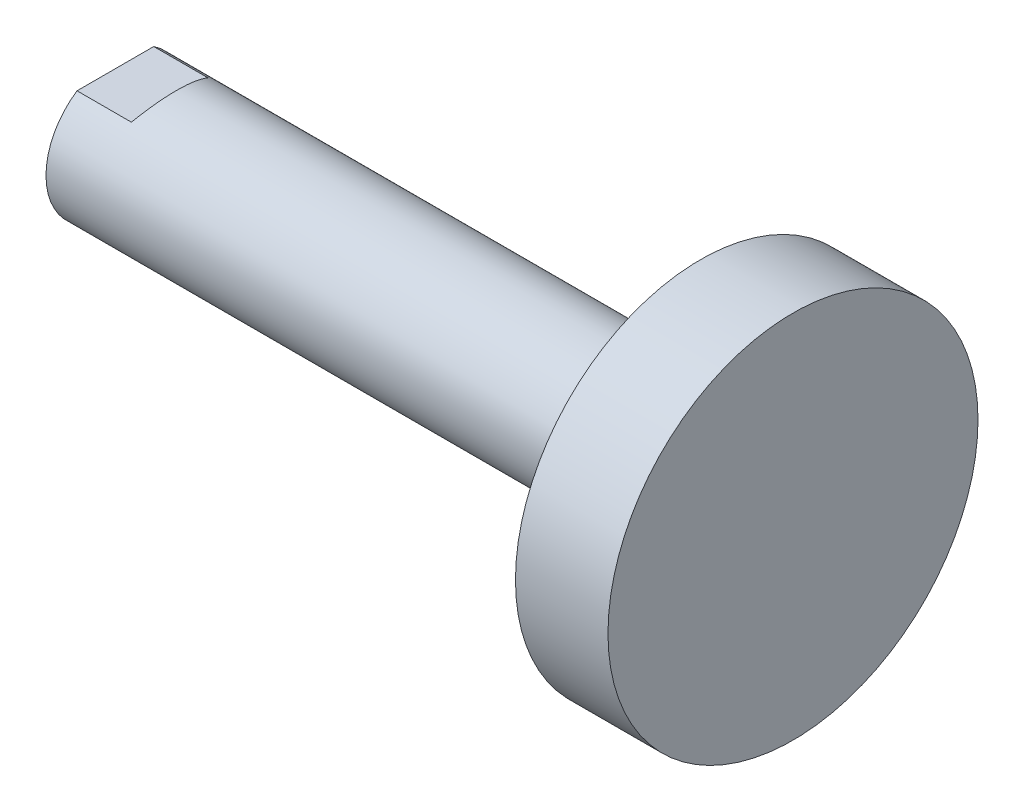
ISO-10303-21;
HEADER;
FILE_DESCRIPTION(('STEP AP214'),'2;1');
FILE_NAME('part.step','',(''),(''),'','','');
FILE_SCHEMA(('AUTOMOTIVE_DESIGN { 1 0 10303 214 1 1 1 1 }'));
ENDSEC;
DATA;
#1=APPLICATION_CONTEXT('core data for automotive mechanical design processes');
#2=APPLICATION_PROTOCOL_DEFINITION('international standard','automotive_design',2000,#1);
#3=PRODUCT_CONTEXT('',#1,'mechanical');
#4=PRODUCT('Part','Part','',(#3));
#5=PRODUCT_RELATED_PRODUCT_CATEGORY('part','',(#4));
#6=PRODUCT_DEFINITION_FORMATION('','',#4);
#7=PRODUCT_DEFINITION_CONTEXT('part definition',#1,'design');
#8=PRODUCT_DEFINITION('design','',#6,#7);
#9=PRODUCT_DEFINITION_SHAPE('','',#8);
#10=(LENGTH_UNIT() NAMED_UNIT(*) SI_UNIT(.MILLI.,.METRE.));
#11=(NAMED_UNIT(*) PLANE_ANGLE_UNIT() SI_UNIT($,.RADIAN.));
#12=(NAMED_UNIT(*) SI_UNIT($,.STERADIAN.) SOLID_ANGLE_UNIT());
#13=UNCERTAINTY_MEASURE_WITH_UNIT(LENGTH_MEASURE(1.E-05),#10,'distance_accuracy_value','');
#14=(GEOMETRIC_REPRESENTATION_CONTEXT(3) GLOBAL_UNCERTAINTY_ASSIGNED_CONTEXT((#13)) GLOBAL_UNIT_ASSIGNED_CONTEXT((#10,
#11,#12)) REPRESENTATION_CONTEXT('',''));
#15=CARTESIAN_POINT('',(0.,0.,0.));
#16=DIRECTION('',(0.,0.,1.));
#17=DIRECTION('',(1.,0.,0.));
#18=AXIS2_PLACEMENT_3D('',#15,#16,#17);
#19=CARTESIAN_POINT('',(52.6,0.,0.));
#20=DIRECTION('',(1.,0.,0.));
#21=DIRECTION('',(0.,0.,-1.));
#22=AXIS2_PLACEMENT_3D('',#19,#20,#21);
#23=CYLINDRICAL_SURFACE('',#22,6.);
#24=CARTESIAN_POINT('',(44.6,0.,0.));
#25=DIRECTION('',(1.,0.,0.));
#26=DIRECTION('',(0.,0.,-1.));
#27=AXIS2_PLACEMENT_3D('',#24,#25,#26);
#28=CIRCLE('',#27,6.);
#29=CARTESIAN_POINT('',(44.6,0.,-6.));
#30=VERTEX_POINT('',#29);
#31=EDGE_CURVE('E5',#30,#30,#28,.T.);
#32=ORIENTED_EDGE('',*,*,#31,.F.);
#33=EDGE_LOOP('',(#32));
#34=FACE_BOUND('',#33,.T.);
#35=DIRECTION('',(1.,0.,0.));
#36=VECTOR('',#35,1.);
#37=CARTESIAN_POINT('',(-6.,-5.,-3.3166247903554));
#38=LINE('',#37,#36);
#39=CARTESIAN_POINT('',(-6.,-5.,-3.3166247903554));
#40=VERTEX_POINT('',#39);
#41=CARTESIAN_POINT('',(-1.3,-5.,-3.3166247903554));
#42=VERTEX_POINT('',#41);
#43=EDGE_CURVE('E11',#40,#42,#38,.T.);
#44=ORIENTED_EDGE('',*,*,#43,.F.);
#45=CARTESIAN_POINT('',(-6.,0.,0.));
#46=DIRECTION('',(1.,0.,0.));
#47=DIRECTION('',(0.,-0.833333333333333,-0.552770798392567));
#48=AXIS2_PLACEMENT_3D('',#45,#46,#47);
#49=CIRCLE('',#48,6.);
#50=CARTESIAN_POINT('',(-6.,5.,-3.3166247903554));
#51=VERTEX_POINT('',#50);
#52=EDGE_CURVE('E18',#40,#51,#49,.T.);
#53=ORIENTED_EDGE('',*,*,#52,.T.);
#54=DIRECTION('',(-1.,0.,0.));
#55=VECTOR('',#54,1.);
#56=CARTESIAN_POINT('',(-1.3,5.,-3.3166247903554));
#57=LINE('',#56,#55);
#58=CARTESIAN_POINT('',(-1.3,5.,-3.3166247903554));
#59=VERTEX_POINT('',#58);
#60=EDGE_CURVE('E25',#59,#51,#57,.T.);
#61=ORIENTED_EDGE('',*,*,#60,.F.);
#62=CARTESIAN_POINT('',(-1.29999999994319,5.0000000000984,3.31662479020705));
#63=CARTESIAN_POINT('',(-1.11503634767914,5.32036644337323,2.833654204829));
#64=CARTESIAN_POINT('',(-0.968993716380155,5.57331970085413,2.29999940642807));
#65=CARTESIAN_POINT('',(-0.771259394775635,5.91580559227332,1.16410220853925));
#66=CARTESIAN_POINT('',(-0.722649730810375,6.,0.59409297687199));
#67=CARTESIAN_POINT('',(-0.722649730810375,6.,-0.594093056156842));
#68=CARTESIAN_POINT('',(-0.772030869821292,5.91446935829747,-1.16853407495185));
#69=CARTESIAN_POINT('',(-0.919174457078327,5.65960918916034,-2.01380951050804));
#70=CARTESIAN_POINT('',(-0.979644321506999,5.55487231164308,-2.28671705457227));
#71=CARTESIAN_POINT('',(-1.08745011324711,5.36814720299902,-2.6841043065642));
#72=CARTESIAN_POINT('',(-1.12625234921285,5.30093975885908,-2.81450572033792));
#73=CARTESIAN_POINT('',(-1.18837922540405,5.19333285278038,-3.00576863288726));
#74=CARTESIAN_POINT('',(-1.2098074372854,5.15621810108653,-3.06900131219313));
#75=CARTESIAN_POINT('',(-1.24287986197959,5.0989349811867,-3.16262558607314));
#76=CARTESIAN_POINT('',(-1.25408018625877,5.0795354504739,-3.19369060156139));
#77=CARTESIAN_POINT('',(-1.27679710657369,5.04018859029698,-3.25543223326225));
#78=CARTESIAN_POINT('',(-1.28833230383595,5.02020904256341,-3.28615851754343));
#79=CARTESIAN_POINT('',(-1.30000014961363,4.99999974086159,-3.31662518102122));
#80=B_SPLINE_CURVE_WITH_KNOTS('',3,(#62,#63,#64,#65,#66,#67,#68,#69,#70,#71,#72,#73,#74,#75,#76,
#77,#78,#79),.UNSPECIFIED.,.F.,.F.,(4,2,2,2,2,2,2,2,4),(5.6974997637521,5.99034253546585,
6.28318530717959,6.57602811797474,6.72244952337232,6.79566022607111,6.83226557742051,
6.85056825309521,6.8688709287699),.UNSPECIFIED.);
#81=CARTESIAN_POINT('',(-1.3,5.,3.3166247903554));
#82=VERTEX_POINT('',#81);
#83=EDGE_CURVE('E29',#82,#59,#80,.T.);
#84=ORIENTED_EDGE('',*,*,#83,.F.);
#85=DIRECTION('',(1.,0.,0.));
#86=VECTOR('',#85,1.);
#87=CARTESIAN_POINT('',(-6.,5.,3.3166247903554));
#88=LINE('',#87,#86);
#89=CARTESIAN_POINT('',(-6.,5.,3.3166247903554));
#90=VERTEX_POINT('',#89);
#91=EDGE_CURVE('E47',#90,#82,#88,.T.);
#92=ORIENTED_EDGE('',*,*,#91,.F.);
#93=CARTESIAN_POINT('',(-6.,0.,0.));
#94=DIRECTION('',(1.,0.,0.));
#95=DIRECTION('',(0.,0.833333333333333,0.552770798392567));
#96=AXIS2_PLACEMENT_3D('',#93,#94,#95);
#97=CIRCLE('',#96,6.);
#98=CARTESIAN_POINT('',(-6.,-5.,3.3166247903554));
#99=VERTEX_POINT('',#98);
#100=EDGE_CURVE('E54',#90,#99,#97,.T.);
#101=ORIENTED_EDGE('',*,*,#100,.T.);
#102=DIRECTION('',(-1.,0.,0.));
#103=VECTOR('',#102,1.);
#104=CARTESIAN_POINT('',(-1.3,-5.,3.3166247903554));
#105=LINE('',#104,#103);
#106=CARTESIAN_POINT('',(-1.3,-5.,3.3166247903554));
#107=VERTEX_POINT('',#106);
#108=EDGE_CURVE('E61',#107,#99,#105,.T.);
#109=ORIENTED_EDGE('',*,*,#108,.F.);
#110=CARTESIAN_POINT('',(-1.29999999994318,-5.00000000009839,-3.31662479020705));
#111=CARTESIAN_POINT('',(-1.11503634767914,-5.32036644337322,-2.833654204829));
#112=CARTESIAN_POINT('',(-0.968993716380148,-5.57331970085412,-2.29999940642807));
#113=CARTESIAN_POINT('',(-0.771259394775627,-5.91580559227331,-1.16410220853924));
#114=CARTESIAN_POINT('',(-0.722649730810368,-5.99999999999999,-0.59409297687199));
#115=CARTESIAN_POINT('',(-0.722649730810368,-5.99999999999999,0.59409305615684));
#116=CARTESIAN_POINT('',(-0.772030869821284,-5.91446935829746,1.16853407495185));
#117=CARTESIAN_POINT('',(-0.919174457078321,-5.65960918916033,2.01380951050804));
#118=CARTESIAN_POINT('',(-0.979644321506994,-5.55487231164307,2.28671705457227));
#119=CARTESIAN_POINT('',(-1.0874501132471,-5.36814720299901,2.6841043065642));
#120=CARTESIAN_POINT('',(-1.12625234921284,-5.30093975885908,2.81450572033792));
#121=CARTESIAN_POINT('',(-1.18837922540404,-5.19333285278037,3.00576863288726));
#122=CARTESIAN_POINT('',(-1.20980743728539,-5.15621810108652,3.06900131219313));
#123=CARTESIAN_POINT('',(-1.24287986197958,-5.09893498118669,3.16262558607314));
#124=CARTESIAN_POINT('',(-1.25408018625877,-5.0795354504739,3.19369060156139));
#125=CARTESIAN_POINT('',(-1.27679710657368,-5.04018859029698,3.25543223326225));
#126=CARTESIAN_POINT('',(-1.28833230383594,-5.02020904256341,3.28615851754343));
#127=CARTESIAN_POINT('',(-1.30000014961362,-4.99999974086158,3.31662518102122));
#128=B_SPLINE_CURVE_WITH_KNOTS('',3,(#110,#111,#112,#113,#114,#115,#116,#117,#118,#119,#120,
#121,#122,#123,#124,#125,#126,#127),.UNSPECIFIED.,.F.,.F.,(4,2,2,2,2,2,2,2,4),(5.6974997637521,
5.99034253546585,6.28318530717959,6.57602811797474,6.72244952337232,6.79566022607111,
6.83226557742051,6.85056825309521,6.8688709287699),.UNSPECIFIED.);
#129=EDGE_CURVE('E65',#42,#107,#128,.T.);
#130=ORIENTED_EDGE('',*,*,#129,.F.);
#131=EDGE_LOOP('',(#44,#53,#61,#84,#92,#101,#109,#130));
#132=FACE_BOUND('',#131,.T.);
#133=ADVANCED_FACE('F80',(#34,#132),#23,.T.);
#134=CARTESIAN_POINT('',(44.6,0.,0.));
#135=DIRECTION('',(1.,0.,0.));
#136=DIRECTION('',(0.,0.,-1.));
#137=AXIS2_PLACEMENT_3D('',#134,#135,#136);
#138=PLANE('',#137);
#139=CARTESIAN_POINT('',(44.6,0.,0.));
#140=DIRECTION('',(1.,0.,0.));
#141=DIRECTION('',(0.,0.,-1.));
#142=AXIS2_PLACEMENT_3D('',#139,#140,#141);
#143=CIRCLE('',#142,16.);
#144=CARTESIAN_POINT('',(44.6,0.,-16.));
#145=VERTEX_POINT('',#144);
#146=EDGE_CURVE('E91',#145,#145,#143,.T.);
#147=ORIENTED_EDGE('',*,*,#146,.F.);
#148=EDGE_LOOP('',(#147));
#149=FACE_BOUND('',#148,.T.);
#150=ORIENTED_EDGE('',*,*,#31,.T.);
#151=EDGE_LOOP('',(#150));
#152=FACE_BOUND('',#151,.T.);
#153=ADVANCED_FACE('F97',(#149,#152),#138,.F.);
#154=CARTESIAN_POINT('',(-1.3,-5.,12.));
#155=DIRECTION('',(0.,-1.,0.));
#156=DIRECTION('',(0.,0.,-1.));
#157=AXIS2_PLACEMENT_3D('',#154,#155,#156);
#158=PLANE('',#157);
#159=ORIENTED_EDGE('',*,*,#43,.T.);
#160=DIRECTION('',(0.,0.,-1.));
#161=VECTOR('',#160,1.);
#162=CARTESIAN_POINT('',(-1.3,-5.,3.3166247903554));
#163=LINE('',#162,#161);
#164=EDGE_CURVE('E107',#107,#42,#163,.T.);
#165=ORIENTED_EDGE('',*,*,#164,.F.);
#166=ORIENTED_EDGE('',*,*,#108,.T.);
#167=DIRECTION('',(0.,0.,-1.));
#168=VECTOR('',#167,1.);
#169=CARTESIAN_POINT('',(-6.,-5.,3.3166247903554));
#170=LINE('',#169,#168);
#171=EDGE_CURVE('E113',#99,#40,#170,.T.);
#172=ORIENTED_EDGE('',*,*,#171,.T.);
#173=EDGE_LOOP('',(#159,#165,#166,#172));
#174=FACE_BOUND('',#173,.T.);
#175=ADVANCED_FACE('F117',(#174),#158,.T.);
#176=CARTESIAN_POINT('',(-6.,0.,0.));
#177=DIRECTION('',(1.,0.,0.));
#178=DIRECTION('',(0.,0.,-1.));
#179=AXIS2_PLACEMENT_3D('',#176,#177,#178);
#180=PLANE('',#179);
#181=ORIENTED_EDGE('',*,*,#100,.F.);
#182=DIRECTION('',(0.,0.,1.));
#183=VECTOR('',#182,1.);
#184=CARTESIAN_POINT('',(-6.,5.,-3.3166247903554));
#185=LINE('',#184,#183);
#186=EDGE_CURVE('E127',#51,#90,#185,.T.);
#187=ORIENTED_EDGE('',*,*,#186,.F.);
#188=ORIENTED_EDGE('',*,*,#52,.F.);
#189=ORIENTED_EDGE('',*,*,#171,.F.);
#190=EDGE_LOOP('',(#181,#187,#188,#189));
#191=FACE_BOUND('',#190,.T.);
#192=CARTESIAN_POINT('',(-6.,0.,0.));
#193=DIRECTION('',(1.,0.,0.));
#194=DIRECTION('',(0.,0.,-1.));
#195=AXIS2_PLACEMENT_3D('',#192,#193,#194);
#196=CIRCLE('',#195,4.6);
#197=CARTESIAN_POINT('',(-6.,0.,-4.6));
#198=VERTEX_POINT('',#197);
#199=EDGE_CURVE('E133',#198,#198,#196,.T.);
#200=ORIENTED_EDGE('',*,*,#199,.T.);
#201=EDGE_LOOP('',(#200));
#202=FACE_BOUND('',#201,.T.);
#203=ADVANCED_FACE('F137',(#191,#202),#180,.F.);
#204=CARTESIAN_POINT('',(-6.,5.,12.));
#205=DIRECTION('',(0.,1.,0.));
#206=DIRECTION('',(0.,0.,1.));
#207=AXIS2_PLACEMENT_3D('',#204,#205,#206);
#208=PLANE('',#207);
#209=ORIENTED_EDGE('',*,*,#91,.T.);
#210=DIRECTION('',(0.,0.,-1.));
#211=VECTOR('',#210,1.);
#212=CARTESIAN_POINT('',(-1.3,5.,3.3166247903554));
#213=LINE('',#212,#211);
#214=EDGE_CURVE('E147',#82,#59,#213,.T.);
#215=ORIENTED_EDGE('',*,*,#214,.T.);
#216=ORIENTED_EDGE('',*,*,#60,.T.);
#217=ORIENTED_EDGE('',*,*,#186,.T.);
#218=EDGE_LOOP('',(#209,#215,#216,#217));
#219=FACE_BOUND('',#218,.T.);
#220=ADVANCED_FACE('F153',(#219),#208,.T.);
#221=CARTESIAN_POINT('',(-1.3,5.,12.));
#222=DIRECTION('',(-0.866025403784438,0.5,0.));
#223=DIRECTION('',(-0.5,-0.866025403784438,0.));
#224=AXIS2_PLACEMENT_3D('',#221,#222,#223);
#225=PLANE('',#224);
#226=ORIENTED_EDGE('',*,*,#83,.T.);
#227=ORIENTED_EDGE('',*,*,#214,.F.);
#228=EDGE_LOOP('',(#226,#227));
#229=FACE_BOUND('',#228,.T.);
#230=ADVANCED_FACE('F173',(#229),#225,.T.);
#231=CARTESIAN_POINT('',(5.0508529610859,-16.,12.));
#232=DIRECTION('',(-0.866025403784438,-0.5,0.));
#233=DIRECTION('',(0.5,-0.866025403784438,0.));
#234=AXIS2_PLACEMENT_3D('',#231,#232,#233);
#235=PLANE('',#234);
#236=ORIENTED_EDGE('',*,*,#129,.T.);
#237=ORIENTED_EDGE('',*,*,#164,.T.);
#238=EDGE_LOOP('',(#236,#237));
#239=FACE_BOUND('',#238,.T.);
#240=ADVANCED_FACE('F193',(#239),#235,.T.);
#241=CARTESIAN_POINT('',(52.6,0.,0.));
#242=DIRECTION('',(1.,0.,0.));
#243=DIRECTION('',(0.,0.,-1.));
#244=AXIS2_PLACEMENT_3D('',#241,#242,#243);
#245=CYLINDRICAL_SURFACE('',#244,16.);
#246=CARTESIAN_POINT('',(52.6,0.,0.));
#247=DIRECTION('',(1.,0.,0.));
#248=DIRECTION('',(0.,0.,-1.));
#249=AXIS2_PLACEMENT_3D('',#246,#247,#248);
#250=CIRCLE('',#249,16.);
#251=CARTESIAN_POINT('',(52.6,0.,-16.));
#252=VERTEX_POINT('',#251);
#253=EDGE_CURVE('E200',#252,#252,#250,.T.);
#254=ORIENTED_EDGE('',*,*,#253,.F.);
#255=EDGE_LOOP('',(#254));
#256=FACE_BOUND('',#255,.T.);
#257=ORIENTED_EDGE('',*,*,#146,.T.);
#258=EDGE_LOOP('',(#257));
#259=FACE_BOUND('',#258,.T.);
#260=ADVANCED_FACE('F206',(#256,#259),#245,.T.);
#261=CARTESIAN_POINT('',(-6.,0.,0.));
#262=DIRECTION('',(-1.,0.,0.));
#263=DIRECTION('',(0.,0.,1.));
#264=AXIS2_PLACEMENT_3D('',#261,#262,#263);
#265=CONICAL_SURFACE('',#264,4.6,0.78539816339745);
#266=CARTESIAN_POINT('',(-5.6,0.,0.));
#267=DIRECTION('',(1.,0.,0.));
#268=DIRECTION('',(0.,0.,-1.));
#269=AXIS2_PLACEMENT_3D('',#266,#267,#268);
#270=CIRCLE('',#269,4.2);
#271=CARTESIAN_POINT('',(-5.6,0.,-4.2));
#272=VERTEX_POINT('',#271);
#273=EDGE_CURVE('E213',#272,#272,#270,.T.);
#274=ORIENTED_EDGE('',*,*,#273,.T.);
#275=EDGE_LOOP('',(#274));
#276=FACE_BOUND('',#275,.T.);
#277=ORIENTED_EDGE('',*,*,#199,.F.);
#278=EDGE_LOOP('',(#277));
#279=FACE_BOUND('',#278,.T.);
#280=ADVANCED_FACE('F219',(#276,#279),#265,.F.);
#281=CARTESIAN_POINT('',(52.6,6.,0.));
#282=DIRECTION('',(-1.,0.,0.));
#283=DIRECTION('',(0.,0.,1.));
#284=AXIS2_PLACEMENT_3D('',#281,#282,#283);
#285=PLANE('',#284);
#286=ORIENTED_EDGE('',*,*,#253,.T.);
#287=EDGE_LOOP('',(#286));
#288=FACE_BOUND('',#287,.T.);
#289=ADVANCED_FACE('F228',(#288),#285,.F.);
#290=CARTESIAN_POINT('',(15.918823619652,0.,0.));
#291=DIRECTION('',(1.,0.,0.));
#292=DIRECTION('',(0.,0.,-1.));
#293=AXIS2_PLACEMENT_3D('',#290,#291,#292);
#294=CYLINDRICAL_SURFACE('',#293,4.2);
#295=CARTESIAN_POINT('',(-2.7,0.,0.));
#296=DIRECTION('',(1.,0.,0.));
#297=DIRECTION('',(0.,0.,-1.));
#298=AXIS2_PLACEMENT_3D('',#295,#296,#297);
#299=CIRCLE('',#298,4.2);
#300=CARTESIAN_POINT('',(-2.7,0.,-4.2));
#301=VERTEX_POINT('',#300);
#302=EDGE_CURVE('E235',#301,#301,#299,.T.);
#303=ORIENTED_EDGE('',*,*,#302,.T.);
#304=EDGE_LOOP('',(#303));
#305=FACE_BOUND('',#304,.T.);
#306=ORIENTED_EDGE('',*,*,#273,.F.);
#307=EDGE_LOOP('',(#306));
#308=FACE_BOUND('',#307,.T.);
#309=ADVANCED_FACE('F241',(#305,#308),#294,.F.);
#310=CARTESIAN_POINT('',(-2.7,4.2,0.));
#311=DIRECTION('',(-1.,0.,0.));
#312=DIRECTION('',(0.,0.,1.));
#313=AXIS2_PLACEMENT_3D('',#310,#311,#312);
#314=PLANE('',#313);
#315=CARTESIAN_POINT('',(-2.7,0.,0.));
#316=DIRECTION('',(1.,0.,0.));
#317=DIRECTION('',(0.,0.,-1.));
#318=AXIS2_PLACEMENT_3D('',#315,#316,#317);
#319=CIRCLE('',#318,4.);
#320=CARTESIAN_POINT('',(-2.7,0.,-4.));
#321=VERTEX_POINT('',#320);
#322=EDGE_CURVE('E248',#321,#321,#319,.T.);
#323=ORIENTED_EDGE('',*,*,#322,.T.);
#324=EDGE_LOOP('',(#323));
#325=FACE_BOUND('',#324,.T.);
#326=ORIENTED_EDGE('',*,*,#302,.F.);
#327=EDGE_LOOP('',(#326));
#328=FACE_BOUND('',#327,.T.);
#329=ADVANCED_FACE('F254',(#325,#328),#314,.T.);
#330=CARTESIAN_POINT('',(-2.7,0.,0.));
#331=DIRECTION('',(-1.,0.,0.));
#332=DIRECTION('',(0.,0.,1.));
#333=AXIS2_PLACEMENT_3D('',#330,#331,#332);
#334=CONICAL_SURFACE('',#333,4.,0.785398163397448);
#335=CARTESIAN_POINT('',(-2.0235,0.,0.));
#336=DIRECTION('',(1.,0.,0.));
#337=DIRECTION('',(0.,0.,-1.));
#338=AXIS2_PLACEMENT_3D('',#335,#336,#337);
#339=CIRCLE('',#338,3.3235);
#340=CARTESIAN_POINT('',(-2.0235,0.,-3.3235));
#341=VERTEX_POINT('',#340);
#342=EDGE_CURVE('E261',#341,#341,#339,.T.);
#343=ORIENTED_EDGE('',*,*,#342,.T.);
#344=EDGE_LOOP('',(#343));
#345=FACE_BOUND('',#344,.T.);
#346=ORIENTED_EDGE('',*,*,#322,.F.);
#347=EDGE_LOOP('',(#346));
#348=FACE_BOUND('',#347,.T.);
#349=ADVANCED_FACE('F267',(#345,#348),#334,.F.);
#350=CARTESIAN_POINT('',(15.918823619652,0.,0.));
#351=DIRECTION('',(1.,0.,0.));
#352=DIRECTION('',(0.,0.,-1.));
#353=AXIS2_PLACEMENT_3D('',#350,#351,#352);
#354=CYLINDRICAL_SURFACE('',#353,3.3235);
#355=CARTESIAN_POINT('',(14.,0.,0.));
#356=DIRECTION('',(1.,0.,0.));
#357=DIRECTION('',(0.,0.,-1.));
#358=AXIS2_PLACEMENT_3D('',#355,#356,#357);
#359=CIRCLE('',#358,3.3235);
#360=CARTESIAN_POINT('',(14.,0.,-3.3235));
#361=VERTEX_POINT('',#360);
#362=EDGE_CURVE('E274',#361,#361,#359,.T.);
#363=ORIENTED_EDGE('',*,*,#362,.T.);
#364=EDGE_LOOP('',(#363));
#365=FACE_BOUND('',#364,.T.);
#366=ORIENTED_EDGE('',*,*,#342,.F.);
#367=EDGE_LOOP('',(#366));
#368=FACE_BOUND('',#367,.T.);
#369=ADVANCED_FACE('F280',(#365,#368),#354,.F.);
#370=CARTESIAN_POINT('',(14.,0.,0.));
#371=DIRECTION('',(-1.,0.,0.));
#372=DIRECTION('',(0.,0.,1.));
#373=AXIS2_PLACEMENT_3D('',#370,#371,#372);
#374=CONICAL_SURFACE('',#373,3.3235,1.04719755119653);
#375=CARTESIAN_POINT('',(15.918823619652,0.,0.));
#376=VERTEX_POINT('',#375);
#377=VERTEX_LOOP('',#376);
#378=FACE_BOUND('',#377,.T.);
#379=ORIENTED_EDGE('',*,*,#362,.F.);
#380=EDGE_LOOP('',(#379));
#381=FACE_BOUND('',#380,.T.);
#382=ADVANCED_FACE('F293',(#378,#381),#374,.F.);
#383=CLOSED_SHELL('',(#133,#153,#175,#203,#220,#230,#240,#260,#280,#289,#309,#329,#349,#369,#382));
#384=MANIFOLD_SOLID_BREP('B1',#383);
#385=ADVANCED_BREP_SHAPE_REPRESENTATION('',(#18,#384),#14);
#386=SHAPE_DEFINITION_REPRESENTATION(#9,#385);
ENDSEC;
END-ISO-10303-21;
